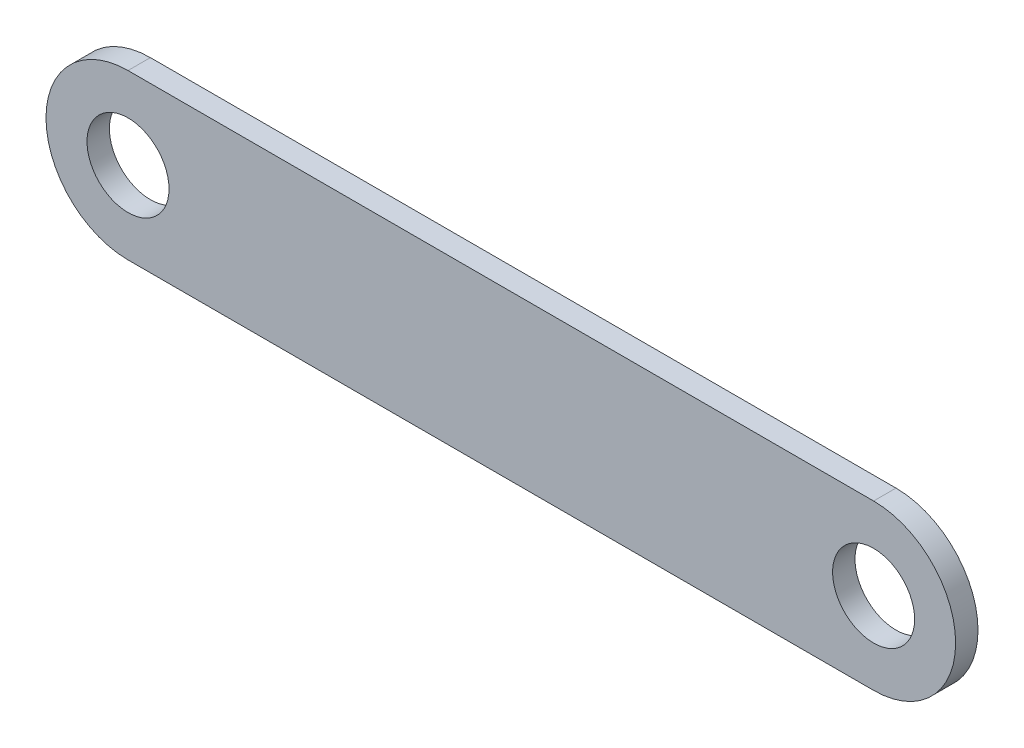
ISO-10303-21;
HEADER;
FILE_DESCRIPTION(('STEP AP214'),'2;1');
FILE_NAME('part.step','',(''),(''),'','','');
FILE_SCHEMA(('AUTOMOTIVE_DESIGN { 1 0 10303 214 1 1 1 1 }'));
ENDSEC;
DATA;
#1=APPLICATION_CONTEXT('core data for automotive mechanical design processes');
#2=APPLICATION_PROTOCOL_DEFINITION('international standard','automotive_design',2000,#1);
#3=PRODUCT_CONTEXT('',#1,'mechanical');
#4=PRODUCT('Part','Part','',(#3));
#5=PRODUCT_RELATED_PRODUCT_CATEGORY('part','',(#4));
#6=PRODUCT_DEFINITION_FORMATION('','',#4);
#7=PRODUCT_DEFINITION_CONTEXT('part definition',#1,'design');
#8=PRODUCT_DEFINITION('design','',#6,#7);
#9=PRODUCT_DEFINITION_SHAPE('','',#8);
#10=(LENGTH_UNIT() NAMED_UNIT(*) SI_UNIT(.MILLI.,.METRE.));
#11=(NAMED_UNIT(*) PLANE_ANGLE_UNIT() SI_UNIT($,.RADIAN.));
#12=(NAMED_UNIT(*) SI_UNIT($,.STERADIAN.) SOLID_ANGLE_UNIT());
#13=UNCERTAINTY_MEASURE_WITH_UNIT(LENGTH_MEASURE(1.E-05),#10,'distance_accuracy_value','');
#14=(GEOMETRIC_REPRESENTATION_CONTEXT(3) GLOBAL_UNCERTAINTY_ASSIGNED_CONTEXT((#13)) GLOBAL_UNIT_ASSIGNED_CONTEXT((#10,
#11,#12)) REPRESENTATION_CONTEXT('',''));
#15=CARTESIAN_POINT('',(0.,0.,0.));
#16=DIRECTION('',(0.,0.,1.));
#17=DIRECTION('',(1.,0.,0.));
#18=AXIS2_PLACEMENT_3D('',#15,#16,#17);
#19=CARTESIAN_POINT('',(-100.,0.,6.));
#20=DIRECTION('',(0.,0.,1.));
#21=DIRECTION('',(1.,0.,0.));
#22=AXIS2_PLACEMENT_3D('',#19,#20,#21);
#23=PLANE('',#22);
#24=CARTESIAN_POINT('',(100.,0.,6.));
#25=DIRECTION('',(0.,0.,1.));
#26=DIRECTION('',(1.,0.,0.));
#27=AXIS2_PLACEMENT_3D('',#24,#25,#26);
#28=CIRCLE('',#27,11.);
#29=CARTESIAN_POINT('',(111.,0.,6.));
#30=VERTEX_POINT('',#29);
#31=EDGE_CURVE('E112',#30,#30,#28,.T.);
#32=ORIENTED_EDGE('',*,*,#31,.F.);
#33=EDGE_LOOP('',(#32));
#34=FACE_BOUND('',#33,.T.);
#35=CARTESIAN_POINT('',(-100.,0.,6.));
#36=DIRECTION('',(0.,0.,1.));
#37=DIRECTION('',(1.,0.,0.));
#38=AXIS2_PLACEMENT_3D('',#35,#36,#37);
#39=CIRCLE('',#38,22.);
#40=CARTESIAN_POINT('',(-100.,22.,6.));
#41=VERTEX_POINT('',#40);
#42=CARTESIAN_POINT('',(-100.,-22.,6.));
#43=VERTEX_POINT('',#42);
#44=EDGE_CURVE('E92',#41,#43,#39,.T.);
#45=ORIENTED_EDGE('',*,*,#44,.T.);
#46=DIRECTION('',(1.,0.,0.));
#47=VECTOR('',#46,1.);
#48=CARTESIAN_POINT('',(-100.,-22.,6.));
#49=LINE('',#48,#47);
#50=CARTESIAN_POINT('',(100.,-22.,6.));
#51=VERTEX_POINT('',#50);
#52=EDGE_CURVE('E87',#43,#51,#49,.T.);
#53=ORIENTED_EDGE('',*,*,#52,.T.);
#54=CARTESIAN_POINT('',(100.,0.,6.));
#55=DIRECTION('',(0.,0.,1.));
#56=DIRECTION('',(1.,0.,0.));
#57=AXIS2_PLACEMENT_3D('',#54,#55,#56);
#58=CIRCLE('',#57,22.);
#59=CARTESIAN_POINT('',(100.,22.,6.));
#60=VERTEX_POINT('',#59);
#61=EDGE_CURVE('E90',#51,#60,#58,.T.);
#62=ORIENTED_EDGE('',*,*,#61,.T.);
#63=DIRECTION('',(-1.,0.,0.));
#64=VECTOR('',#63,1.);
#65=CARTESIAN_POINT('',(-100.,22.,6.));
#66=LINE('',#65,#64);
#67=EDGE_CURVE('E57',#60,#41,#66,.T.);
#68=ORIENTED_EDGE('',*,*,#67,.T.);
#69=EDGE_LOOP('',(#45,#53,#62,#68));
#70=FACE_BOUND('',#69,.T.);
#71=CARTESIAN_POINT('',(-100.,0.,6.));
#72=DIRECTION('',(0.,0.,1.));
#73=DIRECTION('',(1.,0.,0.));
#74=AXIS2_PLACEMENT_3D('',#71,#72,#73);
#75=CIRCLE('',#74,11.);
#76=CARTESIAN_POINT('',(-89.,0.,6.));
#77=VERTEX_POINT('',#76);
#78=EDGE_CURVE('E134',#77,#77,#75,.T.);
#79=ORIENTED_EDGE('',*,*,#78,.F.);
#80=EDGE_LOOP('',(#79));
#81=FACE_BOUND('',#80,.T.);
#82=ADVANCED_FACE('F39',(#34,#70,#81),#23,.T.);
#83=CARTESIAN_POINT('',(-100.,0.,0.));
#84=DIRECTION('',(0.,0.,1.));
#85=DIRECTION('',(1.,0.,0.));
#86=AXIS2_PLACEMENT_3D('',#83,#84,#85);
#87=PLANE('',#86);
#88=CARTESIAN_POINT('',(-100.,0.,0.));
#89=DIRECTION('',(0.,0.,1.));
#90=DIRECTION('',(1.,0.,0.));
#91=AXIS2_PLACEMENT_3D('',#88,#89,#90);
#92=CIRCLE('',#91,22.);
#93=CARTESIAN_POINT('',(-100.,22.,0.));
#94=VERTEX_POINT('',#93);
#95=CARTESIAN_POINT('',(-100.,-22.,0.));
#96=VERTEX_POINT('',#95);
#97=EDGE_CURVE('E108',#94,#96,#92,.T.);
#98=ORIENTED_EDGE('',*,*,#97,.F.);
#99=DIRECTION('',(-1.,0.,0.));
#100=VECTOR('',#99,1.);
#101=CARTESIAN_POINT('',(-100.,22.,0.));
#102=LINE('',#101,#100);
#103=CARTESIAN_POINT('',(100.,22.,0.));
#104=VERTEX_POINT('',#103);
#105=EDGE_CURVE('E80',#104,#94,#102,.T.);
#106=ORIENTED_EDGE('',*,*,#105,.F.);
#107=CARTESIAN_POINT('',(100.,0.,0.));
#108=DIRECTION('',(0.,0.,1.));
#109=DIRECTION('',(1.,0.,0.));
#110=AXIS2_PLACEMENT_3D('',#107,#108,#109);
#111=CIRCLE('',#110,22.);
#112=CARTESIAN_POINT('',(100.,-22.,0.));
#113=VERTEX_POINT('',#112);
#114=EDGE_CURVE('E74',#113,#104,#111,.T.);
#115=ORIENTED_EDGE('',*,*,#114,.F.);
#116=DIRECTION('',(1.,0.,0.));
#117=VECTOR('',#116,1.);
#118=CARTESIAN_POINT('',(-100.,-22.,0.));
#119=LINE('',#118,#117);
#120=EDGE_CURVE('E97',#96,#113,#119,.T.);
#121=ORIENTED_EDGE('',*,*,#120,.F.);
#122=EDGE_LOOP('',(#98,#106,#115,#121));
#123=FACE_BOUND('',#122,.T.);
#124=CARTESIAN_POINT('',(100.,0.,0.));
#125=DIRECTION('',(0.,0.,1.));
#126=DIRECTION('',(1.,0.,0.));
#127=AXIS2_PLACEMENT_3D('',#124,#125,#126);
#128=CIRCLE('',#127,11.);
#129=CARTESIAN_POINT('',(111.,0.,0.));
#130=VERTEX_POINT('',#129);
#131=EDGE_CURVE('E130',#130,#130,#128,.T.);
#132=ORIENTED_EDGE('',*,*,#131,.T.);
#133=EDGE_LOOP('',(#132));
#134=FACE_BOUND('',#133,.T.);
#135=CARTESIAN_POINT('',(-100.,0.,0.));
#136=DIRECTION('',(0.,0.,1.));
#137=DIRECTION('',(1.,0.,0.));
#138=AXIS2_PLACEMENT_3D('',#135,#136,#137);
#139=CIRCLE('',#138,11.);
#140=CARTESIAN_POINT('',(-89.,0.,0.));
#141=VERTEX_POINT('',#140);
#142=EDGE_CURVE('E138',#141,#141,#139,.T.);
#143=ORIENTED_EDGE('',*,*,#142,.T.);
#144=EDGE_LOOP('',(#143));
#145=FACE_BOUND('',#144,.T.);
#146=ADVANCED_FACE('F125',(#123,#134,#145),#87,.F.);
#147=CARTESIAN_POINT('',(-100.,0.,6.));
#148=DIRECTION('',(0.,0.,-1.));
#149=DIRECTION('',(-1.,0.,0.));
#150=AXIS2_PLACEMENT_3D('',#147,#148,#149);
#151=CYLINDRICAL_SURFACE('',#150,22.);
#152=ORIENTED_EDGE('',*,*,#97,.T.);
#153=DIRECTION('',(0.,0.,-1.));
#154=VECTOR('',#153,1.);
#155=CARTESIAN_POINT('',(-100.,-22.,6.));
#156=LINE('',#155,#154);
#157=EDGE_CURVE('E11',#43,#96,#156,.T.);
#158=ORIENTED_EDGE('',*,*,#157,.F.);
#159=ORIENTED_EDGE('',*,*,#44,.F.);
#160=DIRECTION('',(0.,0.,-1.));
#161=VECTOR('',#160,1.);
#162=CARTESIAN_POINT('',(-100.,22.,6.));
#163=LINE('',#162,#161);
#164=EDGE_CURVE('E104',#41,#94,#163,.T.);
#165=ORIENTED_EDGE('',*,*,#164,.T.);
#166=EDGE_LOOP('',(#152,#158,#159,#165));
#167=FACE_BOUND('',#166,.T.);
#168=ADVANCED_FACE('F41',(#167),#151,.T.);
#169=CARTESIAN_POINT('',(-100.,-22.,6.));
#170=DIRECTION('',(0.,1.,0.));
#171=DIRECTION('',(0.,0.,1.));
#172=AXIS2_PLACEMENT_3D('',#169,#170,#171);
#173=PLANE('',#172);
#174=ORIENTED_EDGE('',*,*,#120,.T.);
#175=DIRECTION('',(0.,0.,-1.));
#176=VECTOR('',#175,1.);
#177=CARTESIAN_POINT('',(100.,-22.,6.));
#178=LINE('',#177,#176);
#179=EDGE_CURVE('E49',#51,#113,#178,.T.);
#180=ORIENTED_EDGE('',*,*,#179,.F.);
#181=ORIENTED_EDGE('',*,*,#52,.F.);
#182=ORIENTED_EDGE('',*,*,#157,.T.);
#183=EDGE_LOOP('',(#174,#180,#181,#182));
#184=FACE_BOUND('',#183,.T.);
#185=ADVANCED_FACE('F96',(#184),#173,.F.);
#186=CARTESIAN_POINT('',(100.,0.,6.));
#187=DIRECTION('',(0.,0.,-1.));
#188=DIRECTION('',(-1.,0.,0.));
#189=AXIS2_PLACEMENT_3D('',#186,#187,#188);
#190=CYLINDRICAL_SURFACE('',#189,22.);
#191=ORIENTED_EDGE('',*,*,#114,.T.);
#192=DIRECTION('',(0.,0.,-1.));
#193=VECTOR('',#192,1.);
#194=CARTESIAN_POINT('',(100.,22.,6.));
#195=LINE('',#194,#193);
#196=EDGE_CURVE('E99',#60,#104,#195,.T.);
#197=ORIENTED_EDGE('',*,*,#196,.F.);
#198=ORIENTED_EDGE('',*,*,#61,.F.);
#199=ORIENTED_EDGE('',*,*,#179,.T.);
#200=EDGE_LOOP('',(#191,#197,#198,#199));
#201=FACE_BOUND('',#200,.T.);
#202=ADVANCED_FACE('F100',(#201),#190,.T.);
#203=CARTESIAN_POINT('',(-100.,22.,6.));
#204=DIRECTION('',(0.,-1.,0.));
#205=DIRECTION('',(0.,0.,-1.));
#206=AXIS2_PLACEMENT_3D('',#203,#204,#205);
#207=PLANE('',#206);
#208=ORIENTED_EDGE('',*,*,#105,.T.);
#209=ORIENTED_EDGE('',*,*,#164,.F.);
#210=ORIENTED_EDGE('',*,*,#67,.F.);
#211=ORIENTED_EDGE('',*,*,#196,.T.);
#212=EDGE_LOOP('',(#208,#209,#210,#211));
#213=FACE_BOUND('',#212,.T.);
#214=ADVANCED_FACE('F122',(#213),#207,.F.);
#215=CARTESIAN_POINT('',(100.,0.,6.));
#216=DIRECTION('',(0.,0.,-1.));
#217=DIRECTION('',(-1.,0.,0.));
#218=AXIS2_PLACEMENT_3D('',#215,#216,#217);
#219=CYLINDRICAL_SURFACE('',#218,11.);
#220=ORIENTED_EDGE('',*,*,#31,.T.);
#221=EDGE_LOOP('',(#220));
#222=FACE_BOUND('',#221,.T.);
#223=ORIENTED_EDGE('',*,*,#131,.F.);
#224=EDGE_LOOP('',(#223));
#225=FACE_BOUND('',#224,.T.);
#226=ADVANCED_FACE('F157',(#222,#225),#219,.F.);
#227=CARTESIAN_POINT('',(-100.,0.,6.));
#228=DIRECTION('',(0.,0.,-1.));
#229=DIRECTION('',(-1.,0.,0.));
#230=AXIS2_PLACEMENT_3D('',#227,#228,#229);
#231=CYLINDRICAL_SURFACE('',#230,11.);
#232=ORIENTED_EDGE('',*,*,#78,.T.);
#233=EDGE_LOOP('',(#232));
#234=FACE_BOUND('',#233,.T.);
#235=ORIENTED_EDGE('',*,*,#142,.F.);
#236=EDGE_LOOP('',(#235));
#237=FACE_BOUND('',#236,.T.);
#238=ADVANCED_FACE('F146',(#234,#237),#231,.F.);
#239=CLOSED_SHELL('',(#82,#146,#168,#185,#202,#214,#226,#238));
#240=MANIFOLD_SOLID_BREP('B2',#239);
#241=ADVANCED_BREP_SHAPE_REPRESENTATION('',(#18,#240),#14);
#242=SHAPE_DEFINITION_REPRESENTATION(#9,#241);
ENDSEC;
END-ISO-10303-21;
